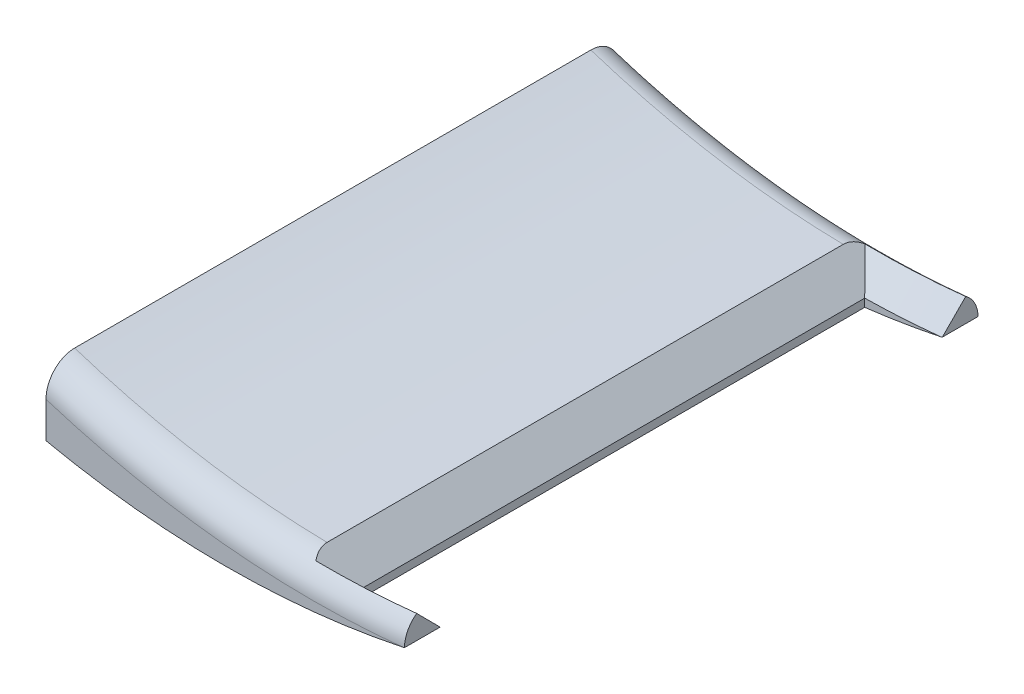
ISO-10303-21;
HEADER;
FILE_DESCRIPTION(('STEP AP214'),'2;1');
FILE_NAME('part.step','',(''),(''),'','','');
FILE_SCHEMA(('AUTOMOTIVE_DESIGN { 1 0 10303 214 1 1 1 1 }'));
ENDSEC;
DATA;
#1=APPLICATION_CONTEXT('core data for automotive mechanical design processes');
#2=APPLICATION_PROTOCOL_DEFINITION('international standard','automotive_design',2000,#1);
#3=PRODUCT_CONTEXT('',#1,'mechanical');
#4=PRODUCT('Part','Part','',(#3));
#5=PRODUCT_RELATED_PRODUCT_CATEGORY('part','',(#4));
#6=PRODUCT_DEFINITION_FORMATION('','',#4);
#7=PRODUCT_DEFINITION_CONTEXT('part definition',#1,'design');
#8=PRODUCT_DEFINITION('design','',#6,#7);
#9=PRODUCT_DEFINITION_SHAPE('','',#8);
#10=(LENGTH_UNIT() NAMED_UNIT(*) SI_UNIT(.MILLI.,.METRE.));
#11=(NAMED_UNIT(*) PLANE_ANGLE_UNIT() SI_UNIT($,.RADIAN.));
#12=(NAMED_UNIT(*) SI_UNIT($,.STERADIAN.) SOLID_ANGLE_UNIT());
#13=UNCERTAINTY_MEASURE_WITH_UNIT(LENGTH_MEASURE(1.E-05),#10,'distance_accuracy_value','');
#14=(GEOMETRIC_REPRESENTATION_CONTEXT(3) GLOBAL_UNCERTAINTY_ASSIGNED_CONTEXT((#13)) GLOBAL_UNIT_ASSIGNED_CONTEXT((#10,
#11,#12)) REPRESENTATION_CONTEXT('',''));
#15=CARTESIAN_POINT('',(0.,0.,0.));
#16=DIRECTION('',(0.,0.,1.));
#17=DIRECTION('',(1.,0.,0.));
#18=AXIS2_PLACEMENT_3D('',#15,#16,#17);
#19=CARTESIAN_POINT('',(31.75,0.,50.8));
#20=DIRECTION('',(-1.,0.,0.));
#21=DIRECTION('',(0.,0.,1.));
#22=AXIS2_PLACEMENT_3D('',#19,#20,#21);
#23=PLANE('',#22);
#24=DIRECTION('',(0.,0.,-1.));
#25=VECTOR('',#24,1.);
#26=CARTESIAN_POINT('',(31.75,0.,50.8));
#27=LINE('',#26,#25);
#28=CARTESIAN_POINT('',(31.75,0.,50.7999605180043));
#29=VERTEX_POINT('',#28);
#30=CARTESIAN_POINT('',(31.75,0.,47.6391621671897));
#31=VERTEX_POINT('',#30);
#32=EDGE_CURVE('E187',#29,#31,#27,.T.);
#33=ORIENTED_EDGE('',*,*,#32,.T.);
#34=CARTESIAN_POINT('',(31.75,0.,47.6391621671897));
#35=CARTESIAN_POINT('',(31.75,0.347081960183324,47.9843718611736));
#36=CARTESIAN_POINT('',(31.75,0.694176777536573,48.3295686263297));
#37=CARTESIAN_POINT('',(31.75,1.38839212659577,49.0199362989994));
#38=CARTESIAN_POINT('',(31.75,1.73551265830171,49.3651072065128));
#39=CARTESIAN_POINT('',(31.75,2.08264604717758,49.7102651851986));
#40=B_SPLINE_CURVE_WITH_KNOTS('',3,(#34,#35,#36,#37,#38,#39),.UNSPECIFIED.,.F.,.F.,(4,2,4),(0.,
1.46857773718991,2.93715547443414),.UNSPECIFIED.);
#41=CARTESIAN_POINT('',(31.75,2.08264604717758,49.7102651851986));
#42=VERTEX_POINT('',#41);
#43=EDGE_CURVE('E251',#31,#42,#40,.T.);
#44=ORIENTED_EDGE('',*,*,#43,.T.);
#45=CARTESIAN_POINT('',(31.75,2.53999999999999,48.26));
#46=CARTESIAN_POINT('',(31.75,2.54000711541741,48.3311454793808));
#47=CARTESIAN_POINT('',(31.75,2.53699353764413,48.4022875808764));
#48=CARTESIAN_POINT('',(31.75,2.52498000334214,48.544060410305));
#49=CARTESIAN_POINT('',(31.75,2.51598040488143,48.6146911685696));
#50=CARTESIAN_POINT('',(31.75,2.49206081084875,48.754880935039));
#51=CARTESIAN_POINT('',(31.75,2.47714625884038,48.8244408677554));
#52=CARTESIAN_POINT('',(31.75,2.44152151778274,48.9620396607442));
#53=CARTESIAN_POINT('',(31.75,2.4208113862735,49.0300785361109));
#54=CARTESIAN_POINT('',(31.75,2.35016491563888,49.2312502522719));
#55=CARTESIAN_POINT('',(31.75,2.29170125913253,49.3615036653736));
#56=CARTESIAN_POINT('',(31.75,2.15382828389797,49.6102895055019));
#57=CARTESIAN_POINT('',(31.75,2.07442172675841,49.7288234750553));
#58=CARTESIAN_POINT('',(31.75,1.89669695928711,49.9512721927552));
#59=CARTESIAN_POINT('',(31.75,1.79833053997607,50.0551484791838));
#60=CARTESIAN_POINT('',(31.75,1.58561751217071,50.245036602651));
#61=CARTESIAN_POINT('',(31.75,1.47126742791714,50.3310445439522));
#62=CARTESIAN_POINT('',(31.75,1.22917708960081,50.4832440275209));
#63=CARTESIAN_POINT('',(31.75,1.10136528975839,50.5493216487146));
#64=CARTESIAN_POINT('',(31.75,0.836524710442424,50.6591667011175));
#65=CARTESIAN_POINT('',(31.75,0.699501046347454,50.7029464004725));
#66=CARTESIAN_POINT('',(31.75,0.468042296266167,50.7560618598585));
#67=CARTESIAN_POINT('',(31.75,0.375080553727432,50.7720578336263));
#68=CARTESIAN_POINT('',(31.75,0.188101414642044,50.793744294961));
#69=CARTESIAN_POINT('',(31.75,0.094085770280669,50.7994498931122));
#70=CARTESIAN_POINT('',(31.75,0.,50.7999605180043));
#71=B_SPLINE_CURVE_WITH_KNOTS('',3,(#45,#46,#47,#48,#49,#50,#51,#52,#53,#54,#55,#56,#57,#58,#59,
#60,#61,#62,#63,#64,#65,#66,#67,#68,#69,#70),.UNSPECIFIED.,.F.,.F.,(4,2,2,2,2,2,2,2,2,2,2,2,4),
(0.,0.213366580793513,0.426720399707228,0.639878321906285,0.853034127892344,1.27914893034338,
1.705207572189,2.13236418977464,2.5596138404695,2.98926127092012,3.41867205659007,
3.70112531335205,3.98316347161579),.UNSPECIFIED.);
#72=EDGE_CURVE('E235',#42,#29,#71,.T.);
#73=ORIENTED_EDGE('',*,*,#72,.T.);
#74=EDGE_LOOP('',(#33,#44,#73));
#75=FACE_BOUND('',#74,.T.);
#76=ADVANCED_FACE('F41',(#75),#23,.F.);
#77=CARTESIAN_POINT('',(15.875,74.5280106738399,50.8));
#78=DIRECTION('',(0.,0.,-1.));
#79=DIRECTION('',(-1.,0.,0.));
#80=AXIS2_PLACEMENT_3D('',#77,#78,#79);
#81=CYLINDRICAL_SURFACE('',#80,76.2);
#82=CARTESIAN_POINT('',(15.875,74.5280106738399,47.625));
#83=DIRECTION('',(0.,0.,1.));
#84=DIRECTION('',(1.,0.,0.));
#85=AXIS2_PLACEMENT_3D('',#82,#83,#84);
#86=CIRCLE('',#85,76.2);
#87=CARTESIAN_POINT('',(24.892,-1.13660266026758,47.625));
#88=VERTEX_POINT('',#87);
#89=CARTESIAN_POINT('',(31.6189381152693,-0.0277966963614096,47.625));
#90=VERTEX_POINT('',#89);
#91=EDGE_CURVE('E161',#88,#90,#86,.T.);
#92=ORIENTED_EDGE('',*,*,#91,.T.);
#93=CARTESIAN_POINT('',(31.6189381152693,-0.0277966963614096,47.625));
#94=CARTESIAN_POINT('',(31.6407859105183,-0.0231831008023858,47.6273596354758));
#95=CARTESIAN_POINT('',(31.6626316318704,-0.0185599116594206,47.6297196338129));
#96=CARTESIAN_POINT('',(31.7063189267806,-0.00929434620561249,47.6344403562094));
#97=CARTESIAN_POINT('',(31.7281605003388,-0.0046519698947695,47.6368010802689));
#98=CARTESIAN_POINT('',(31.75,0.,47.6391621671897));
#99=B_SPLINE_CURVE_WITH_KNOTS('',3,(#93,#94,#95,#96,#97,#98),.UNSPECIFIED.,.F.,.F.,(4,2,4),(0.,
0.0673617926019737,0.134723585203877),.UNSPECIFIED.);
#100=EDGE_CURVE('E259',#90,#31,#99,.T.);
#101=ORIENTED_EDGE('',*,*,#100,.T.);
#102=ORIENTED_EDGE('',*,*,#32,.F.);
#103=CARTESIAN_POINT('',(31.75,0.,50.7999605180043));
#104=CARTESIAN_POINT('',(31.7281604271963,-0.0046519854074364,50.7999736808657));
#105=CARTESIAN_POINT('',(31.7063188170688,-0.00929436947420386,50.7999835524627));
#106=CARTESIAN_POINT('',(31.6626315221586,-0.0185599349280018,50.7999967131279));
#107=CARTESIAN_POINT('',(31.6407858373759,-0.0231831163150256,50.8000000021961));
#108=CARTESIAN_POINT('',(31.6189381152694,-0.0277966963613739,50.8));
#109=B_SPLINE_CURVE_WITH_KNOTS('',3,(#103,#104,#105,#106,#107,#108),.UNSPECIFIED.,.F.,.F.,(4,2,
4),(0.,0.0669885799380031,0.133977159899155),.UNSPECIFIED.);
#110=CARTESIAN_POINT('',(31.6189381152694,-0.0277966963613818,50.8));
#111=VERTEX_POINT('',#110);
#112=EDGE_CURVE('E354',#29,#111,#109,.T.);
#113=ORIENTED_EDGE('',*,*,#112,.T.);
#114=CARTESIAN_POINT('',(15.875,74.5280106738399,50.8));
#115=DIRECTION('',(0.,0.,1.));
#116=DIRECTION('',(1.,0.,0.));
#117=AXIS2_PLACEMENT_3D('',#114,#115,#116);
#118=CIRCLE('',#117,76.2);
#119=CARTESIAN_POINT('',(0.,0.,50.8));
#120=VERTEX_POINT('',#119);
#121=EDGE_CURVE('E171',#120,#111,#118,.T.);
#122=ORIENTED_EDGE('',*,*,#121,.F.);
#123=DIRECTION('',(0.,0.,-1.));
#124=VECTOR('',#123,1.);
#125=CARTESIAN_POINT('',(0.,0.,50.8));
#126=LINE('',#125,#124);
#127=CARTESIAN_POINT('',(0.,0.,0.));
#128=VERTEX_POINT('',#127);
#129=EDGE_CURVE('E177',#120,#128,#126,.T.);
#130=ORIENTED_EDGE('',*,*,#129,.T.);
#131=CARTESIAN_POINT('',(15.875,74.5280106738399,0.));
#132=DIRECTION('',(0.,0.,1.));
#133=DIRECTION('',(1.,0.,0.));
#134=AXIS2_PLACEMENT_3D('',#131,#132,#133);
#135=CIRCLE('',#134,76.2);
#136=CARTESIAN_POINT('',(31.6189381152694,-0.0277966963613818,0.));
#137=VERTEX_POINT('',#136);
#138=EDGE_CURVE('E170',#128,#137,#135,.T.);
#139=ORIENTED_EDGE('',*,*,#138,.T.);
#140=CARTESIAN_POINT('',(31.6189381152694,-0.0277966963613818,0.));
#141=CARTESIAN_POINT('',(31.6407858373759,-0.0231831163150311,-2.19615210893405E-09));
#142=CARTESIAN_POINT('',(31.6626315221586,-0.0185599349280049,3.28687208429315E-06));
#143=CARTESIAN_POINT('',(31.7063188170688,-0.00929436947420212,1.64475373318454E-05));
#144=CARTESIAN_POINT('',(31.7281604271963,-0.00465198540743225,2.6319134340721E-05));
#145=CARTESIAN_POINT('',(31.75,0.,3.94819957358329E-05));
#146=B_SPLINE_CURVE_WITH_KNOTS('',3,(#140,#141,#142,#143,#144,#145),.UNSPECIFIED.,.F.,.F.,(4,2,
4),(0.,0.0669885799611532,0.133977159899158),.UNSPECIFIED.);
#147=CARTESIAN_POINT('',(31.75,0.,3.94819957352799E-05));
#148=VERTEX_POINT('',#147);
#149=EDGE_CURVE('E355',#137,#148,#146,.T.);
#150=ORIENTED_EDGE('',*,*,#149,.T.);
#151=CARTESIAN_POINT('',(31.75,0.,3.16083783281031));
#152=VERTEX_POINT('',#151);
#153=EDGE_CURVE('E186',#152,#148,#27,.T.);
#154=ORIENTED_EDGE('',*,*,#153,.F.);
#155=CARTESIAN_POINT('',(31.75,0.,3.16083783281031));
#156=CARTESIAN_POINT('',(31.7281605003388,-0.00465196989477405,3.16319891973107));
#157=CARTESIAN_POINT('',(31.7063189267806,-0.00929434620561095,3.16555964379059));
#158=CARTESIAN_POINT('',(31.6626316318704,-0.0185599116594161,3.17028036618715));
#159=CARTESIAN_POINT('',(31.6407859105183,-0.0231831008023843,3.1726403645242));
#160=CARTESIAN_POINT('',(31.6189381152693,-0.0277966963614153,3.175));
#161=B_SPLINE_CURVE_WITH_KNOTS('',3,(#155,#156,#157,#158,#159,#160),.UNSPECIFIED.,.F.,.F.,(4,2,
4),(0.,0.0673617926018992,0.13472358520388),.UNSPECIFIED.);
#162=CARTESIAN_POINT('',(31.6189381152693,-0.0277966963614096,3.175));
#163=VERTEX_POINT('',#162);
#164=EDGE_CURVE('E149',#152,#163,#161,.T.);
#165=ORIENTED_EDGE('',*,*,#164,.T.);
#166=CARTESIAN_POINT('',(15.875,74.5280106738399,3.175));
#167=DIRECTION('',(0.,0.,-1.));
#168=DIRECTION('',(-1.,0.,0.));
#169=AXIS2_PLACEMENT_3D('',#166,#167,#168);
#170=CIRCLE('',#169,76.2);
#171=CARTESIAN_POINT('',(24.8919999999999,-1.13660266026756,3.175));
#172=VERTEX_POINT('',#171);
#173=EDGE_CURVE('E142',#163,#172,#170,.T.);
#174=ORIENTED_EDGE('',*,*,#173,.T.);
#175=DIRECTION('',(0.,0.,-1.));
#176=VECTOR('',#175,1.);
#177=CARTESIAN_POINT('',(24.892,-1.13660266026756,50.8));
#178=LINE('',#177,#176);
#179=EDGE_CURVE('E146',#172,#88,#178,.F.);
#180=ORIENTED_EDGE('',*,*,#179,.T.);
#181=EDGE_LOOP('',(#92,#101,#102,#113,#122,#130,#139,#150,#154,#165,#174,#180));
#182=FACE_BOUND('',#181,.T.);
#183=ADVANCED_FACE('F145',(#182),#81,.T.);
#184=CARTESIAN_POINT('',(31.75,0.,3.94819957357136E-05));
#185=CARTESIAN_POINT('',(31.75,0.0721261375730672,0.000432835467919209));
#186=CARTESIAN_POINT('',(31.75,0.144232165825652,0.00387855099690201));
#187=CARTESIAN_POINT('',(31.75,0.287896572910692,0.0168200309804969));
#188=CARTESIAN_POINT('',(31.75,0.359454972641264,0.0263155633904873));
#189=CARTESIAN_POINT('',(31.75,0.501479548830096,0.0512945211707885));
#190=CARTESIAN_POINT('',(31.75,0.571946356743182,0.0667743391667029));
#191=CARTESIAN_POINT('',(31.75,0.711308747662647,0.10359998270911));
#192=CARTESIAN_POINT('',(31.75,0.780204352501169,0.124945726693683));
#193=CARTESIAN_POINT('',(31.75,0.983875073282193,0.197617406979889));
#194=CARTESIAN_POINT('',(31.75,1.11568485982754,0.257586760273364));
#195=CARTESIAN_POINT('',(31.75,1.36723247753913,0.398811903449403));
#196=CARTESIAN_POINT('',(31.75,1.48697296729461,0.480062991201214));
#197=CARTESIAN_POINT('',(31.75,1.71078801821787,0.661396221291593));
#198=CARTESIAN_POINT('',(31.75,1.81489876006721,0.761433627574265));
#199=CARTESIAN_POINT('',(31.75,2.00475711672872,0.977673825231725));
#200=CARTESIAN_POINT('',(31.75,2.09050114704681,1.09387976481215));
#201=CARTESIAN_POINT('',(31.75,2.24069759450068,1.33849611661391));
#202=CARTESIAN_POINT('',(31.75,2.30525551930673,1.46684182022882));
#203=CARTESIAN_POINT('',(31.75,2.41174046982855,1.7325565980873));
#204=CARTESIAN_POINT('',(31.75,2.45368350607421,1.86991921119392));
#205=CARTESIAN_POINT('',(31.75,2.50242292228549,2.09687947920786));
#206=CARTESIAN_POINT('',(31.75,2.51650720301846,2.18497814569898));
#207=CARTESIAN_POINT('',(31.75,2.53529319962916,2.36203821612011));
#208=CARTESIAN_POINT('',(31.75,2.54000875681746,2.45099815191533));
#209=CARTESIAN_POINT('',(31.75,2.54,2.54));
#210=B_SPLINE_CURVE_WITH_KNOTS('',3,(#184,#185,#186,#187,#188,#189,#190,#191,#192,#193,#194,
#195,#196,#197,#198,#199,#200,#201,#202,#203,#204,#205,#206,#207,#208,#209),.UNSPECIFIED.,.F.,
.F.,(4,2,2,2,2,2,2,2,2,2,2,2,4),(0.,0.21631158476205,0.432614873253433,0.648787975229504,
0.864958071609975,1.2971455609344,1.72923764025655,2.16031353026311,2.59147347363844,
3.0204524345617,3.44912729366216,3.71632113037987,3.98311992169222),.UNSPECIFIED.);
#211=CARTESIAN_POINT('',(31.75,2.08264604719354,1.08973481482423));
#212=VERTEX_POINT('',#211);
#213=EDGE_CURVE('E244',#148,#212,#210,.T.);
#214=ORIENTED_EDGE('',*,*,#213,.T.);
#215=CARTESIAN_POINT('',(31.75,2.08264604719353,1.08973481482424));
#216=CARTESIAN_POINT('',(31.75,1.73551265830856,1.4348927934997));
#217=CARTESIAN_POINT('',(31.75,1.38839212659674,1.78006370100613));
#218=CARTESIAN_POINT('',(31.75,0.694176777532229,2.47043137366815));
#219=CARTESIAN_POINT('',(31.75,0.34708196017954,2.81562813882374));
#220=CARTESIAN_POINT('',(31.75,0.,3.1608378328103));
#221=B_SPLINE_CURVE_WITH_KNOTS('',3,(#215,#216,#217,#218,#219,#220),.UNSPECIFIED.,.F.,.F.,(4,2,
4),(0.,1.46857773724185,2.93715547442938),.UNSPECIFIED.);
#222=EDGE_CURVE('E384',#212,#152,#221,.T.);
#223=ORIENTED_EDGE('',*,*,#222,.T.);
#224=ORIENTED_EDGE('',*,*,#153,.T.);
#225=EDGE_LOOP('',(#214,#223,#224));
#226=FACE_BOUND('',#225,.T.);
#227=ADVANCED_FACE('F225',(#226),#23,.F.);
#228=CARTESIAN_POINT('',(23.5824412790761,78.3010122988088,50.8));
#229=DIRECTION('',(0.,0.,-1.));
#230=DIRECTION('',(-1.,0.,0.));
#231=AXIS2_PLACEMENT_3D('',#228,#229,#230);
#232=CYLINDRICAL_SURFACE('',#231,76.2);
#233=CARTESIAN_POINT('',(23.5824412790761,78.3010122988088,48.26));
#234=DIRECTION('',(0.,0.,1.));
#235=DIRECTION('',(1.,0.,0.));
#236=AXIS2_PLACEMENT_3D('',#233,#234,#235);
#237=CIRCLE('',#236,76.2);
#238=CARTESIAN_POINT('',(0.,5.842,48.26));
#239=VERTEX_POINT('',#238);
#240=CARTESIAN_POINT('',(22.3533404432556,2.1109256002403,48.26));
#241=VERTEX_POINT('',#240);
#242=EDGE_CURVE('E190',#239,#241,#237,.T.);
#243=ORIENTED_EDGE('',*,*,#242,.T.);
#244=DIRECTION('',(0.,0.,-1.));
#245=VECTOR('',#244,1.);
#246=CARTESIAN_POINT('',(22.3533404432556,2.1109256002403,50.8));
#247=LINE('',#246,#245);
#248=CARTESIAN_POINT('',(22.3533404432556,2.1109256002403,2.54));
#249=VERTEX_POINT('',#248);
#250=EDGE_CURVE('E387',#241,#249,#247,.T.);
#251=ORIENTED_EDGE('',*,*,#250,.T.);
#252=CARTESIAN_POINT('',(23.5824412790761,78.3010122988088,2.54));
#253=DIRECTION('',(0.,0.,1.));
#254=DIRECTION('',(1.,0.,0.));
#255=AXIS2_PLACEMENT_3D('',#252,#253,#254);
#256=CIRCLE('',#255,76.2);
#257=CARTESIAN_POINT('',(0.,5.842,2.54));
#258=VERTEX_POINT('',#257);
#259=EDGE_CURVE('E193',#249,#258,#256,.F.);
#260=ORIENTED_EDGE('',*,*,#259,.T.);
#261=DIRECTION('',(0.,0.,-1.));
#262=VECTOR('',#261,1.);
#263=CARTESIAN_POINT('',(0.,5.842,50.8));
#264=LINE('',#263,#262);
#265=EDGE_CURVE('E183',#239,#258,#264,.T.);
#266=ORIENTED_EDGE('',*,*,#265,.F.);
#267=EDGE_LOOP('',(#243,#251,#260,#266));
#268=FACE_BOUND('',#267,.T.);
#269=ADVANCED_FACE('F218',(#268),#232,.F.);
#270=CARTESIAN_POINT('',(0.,0.,50.8));
#271=DIRECTION('',(1.,0.,0.));
#272=DIRECTION('',(0.,0.,-1.));
#273=AXIS2_PLACEMENT_3D('',#270,#271,#272);
#274=PLANE('',#273);
#275=ORIENTED_EDGE('',*,*,#265,.T.);
#276=CARTESIAN_POINT('',(0.,5.842,2.54));
#277=CARTESIAN_POINT('',(0.,5.84200911651623,2.47106789074667));
#278=CARTESIAN_POINT('',(0.,5.83904918351451,2.40214016978724));
#279=CARTESIAN_POINT('',(0.,5.82726133043643,2.26479840193036));
#280=CARTESIAN_POINT('',(0.,5.81843429328041,2.19638427930961));
#281=CARTESIAN_POINT('',(0.,5.79500714800403,2.06069745438624));
#282=CARTESIAN_POINT('',(0.,5.78041931058092,1.99342264090847));
#283=CARTESIAN_POINT('',(0.,5.74562027031349,1.86036244755737));
#284=CARTESIAN_POINT('',(0.,5.72540902434634,1.79457707910996));
#285=CARTESIAN_POINT('',(0.,5.65658639242905,1.60014762655043));
#286=CARTESIAN_POINT('',(0.,5.5997641977452,1.47430477855078));
#287=CARTESIAN_POINT('',(0.,5.46625123855288,1.23372960348994));
#288=CARTESIAN_POINT('',(0.,5.38955609859676,1.11899973083634));
#289=CARTESIAN_POINT('',(0.,5.2169247709793,0.901060352722734));
#290=CARTESIAN_POINT('',(0.,5.12061530132623,0.798146480984856));
#291=CARTESIAN_POINT('',(0.,4.91276403216685,0.609070887829376));
#292=CARTESIAN_POINT('',(0.,4.8012182995791,0.522913505888832));
#293=CARTESIAN_POINT('',(0.,4.56056297707693,0.365564305636138));
#294=CARTESIAN_POINT('',(0.,4.43087868262775,0.295252048871446));
#295=CARTESIAN_POINT('',(0.,4.16189599508564,0.17637436381451));
#296=CARTESIAN_POINT('',(0.,4.02259718766523,0.127809873395902));
#297=CARTESIAN_POINT('',(0.,3.76536671526077,0.0605003350236466));
#298=CARTESIAN_POINT('',(0.,3.64844318090178,0.0378288081534124));
#299=CARTESIAN_POINT('',(0.,3.41282476936742,0.00757740642679859));
#300=CARTESIAN_POINT('',(0.,3.29413257963437,-2.33974903120056E-05));
#301=CARTESIAN_POINT('',(0.,3.17541038229219,0.));
#302=B_SPLINE_CURVE_WITH_KNOTS('',3,(#276,#277,#278,#279,#280,#281,#282,#283,#284,#285,#286,
#287,#288,#289,#290,#291,#292,#293,#294,#295,#296,#297,#298,#299,#300,#301),.UNSPECIFIED.,.F.,
.F.,(4,2,2,2,2,2,2,2,2,2,2,2,4),(0.,0.206725197324096,0.41341929232468,0.619675476349062,
0.825933242082334,1.23807164120409,1.65030085849603,2.07126525269274,2.49233852052409,
2.93294346250264,3.37356740376447,3.72992857358107,4.08579450883298),.UNSPECIFIED.);
#303=CARTESIAN_POINT('',(0.,3.17541038229219,0.));
#304=VERTEX_POINT('',#303);
#305=EDGE_CURVE('E203',#258,#304,#302,.T.);
#306=ORIENTED_EDGE('',*,*,#305,.T.);
#307=DIRECTION('',(0.,-1.,0.));
#308=VECTOR('',#307,1.);
#309=CARTESIAN_POINT('',(0.,0.,0.));
#310=LINE('',#309,#308);
#311=EDGE_CURVE('E175',#304,#128,#310,.T.);
#312=ORIENTED_EDGE('',*,*,#311,.T.);
#313=ORIENTED_EDGE('',*,*,#129,.F.);
#314=DIRECTION('',(0.,-1.,0.));
#315=VECTOR('',#314,1.);
#316=CARTESIAN_POINT('',(0.,0.,50.8));
#317=LINE('',#316,#315);
#318=CARTESIAN_POINT('',(0.,3.17541038229219,50.8));
#319=VERTEX_POINT('',#318);
#320=EDGE_CURVE('E174',#319,#120,#317,.T.);
#321=ORIENTED_EDGE('',*,*,#320,.F.);
#322=CARTESIAN_POINT('',(0.,3.17541038229219,50.8));
#323=CARTESIAN_POINT('',(0.,3.25318774515099,50.7999975289093));
#324=CARTESIAN_POINT('',(0.,3.33092820922483,50.7967461678686));
#325=CARTESIAN_POINT('',(0.,3.48586906909553,50.783767412644));
#326=CARTESIAN_POINT('',(0.,3.5630694465063,50.7740397990637));
#327=CARTESIAN_POINT('',(0.,3.79311062821256,50.735182702435));
#328=CARTESIAN_POINT('',(0.,3.94443504324128,50.6963789369505));
#329=CARTESIAN_POINT('',(0.,4.23844812376183,50.5937778279549));
#330=CARTESIAN_POINT('',(0.,4.38112897358825,50.5299582429514));
#331=CARTESIAN_POINT('',(0.,4.65338074719441,50.3787675723494));
#332=CARTESIAN_POINT('',(0.,4.78295879441103,50.2914093793974));
#333=CARTESIAN_POINT('',(0.,5.02206885595859,50.0974373589533));
#334=CARTESIAN_POINT('',(0.,5.13198182596775,49.9912937283955));
#335=CARTESIAN_POINT('',(0.,5.33139055312792,49.7612196947848));
#336=CARTESIAN_POINT('',(0.,5.42088540988703,49.6372885077338));
#337=CARTESIAN_POINT('',(0.,5.57235885418762,49.381402103687));
#338=CARTESIAN_POINT('',(0.,5.63542529885297,49.2500898717283));
#339=CARTESIAN_POINT('',(0.,5.73738530498152,48.9784739933305));
#340=CARTESIAN_POINT('',(0.,5.77631114222621,48.8381826301435));
#341=CARTESIAN_POINT('',(0.,5.8155793190003,48.6237984245374));
#342=CARTESIAN_POINT('',(0.,5.82548269907093,48.5513408658893));
#343=CARTESIAN_POINT('',(0.,5.83868908707226,48.4059349544306));
#344=CARTESIAN_POINT('',(0.,5.84200183357788,48.3329874858174));
#345=CARTESIAN_POINT('',(0.,5.842,48.26));
#346=B_SPLINE_CURVE_WITH_KNOTS('',3,(#322,#323,#324,#325,#326,#327,#328,#329,#330,#331,#332,
#333,#334,#335,#336,#337,#338,#339,#340,#341,#342,#343,#344,#345),.UNSPECIFIED.,.F.,.F.,(4,2,2,
2,2,2,2,2,2,2,2,4),(0.,0.233190575157756,0.466389050531859,0.932656952395885,1.39934035545406,
1.86576866286887,2.32184895116288,2.77794934766453,3.2127968350292,3.64706167458433,
3.8661943261112,4.08500293755266),.UNSPECIFIED.);
#347=EDGE_CURVE('E195',#319,#239,#346,.T.);
#348=ORIENTED_EDGE('',*,*,#347,.T.);
#349=EDGE_LOOP('',(#275,#306,#312,#313,#321,#348));
#350=FACE_BOUND('',#349,.T.);
#351=ADVANCED_FACE('F212',(#350),#274,.F.);
#352=CARTESIAN_POINT('',(15.875,74.5280106738399,50.8));
#353=DIRECTION('',(0.,0.,1.));
#354=DIRECTION('',(1.,0.,0.));
#355=AXIS2_PLACEMENT_3D('',#352,#353,#354);
#356=PLANE('',#355);
#357=ORIENTED_EDGE('',*,*,#121,.T.);
#358=CARTESIAN_POINT('',(23.5824412790761,78.3010122988088,50.8));
#359=DIRECTION('',(0.,0.,1.));
#360=DIRECTION('',(1.,0.,0.));
#361=AXIS2_PLACEMENT_3D('',#358,#359,#360);
#362=CIRCLE('',#361,78.74);
#363=EDGE_CURVE('E334',#111,#319,#362,.F.);
#364=ORIENTED_EDGE('',*,*,#363,.T.);
#365=ORIENTED_EDGE('',*,*,#320,.T.);
#366=EDGE_LOOP('',(#357,#364,#365));
#367=FACE_BOUND('',#366,.T.);
#368=ADVANCED_FACE('F217',(#367),#356,.T.);
#369=CARTESIAN_POINT('',(15.875,74.5280106738399,0.));
#370=DIRECTION('',(0.,0.,1.));
#371=DIRECTION('',(1.,0.,0.));
#372=AXIS2_PLACEMENT_3D('',#369,#370,#371);
#373=PLANE('',#372);
#374=ORIENTED_EDGE('',*,*,#311,.F.);
#375=CARTESIAN_POINT('',(23.5824412790761,78.3010122988088,0.));
#376=DIRECTION('',(0.,0.,1.));
#377=DIRECTION('',(1.,0.,0.));
#378=AXIS2_PLACEMENT_3D('',#375,#376,#377);
#379=CIRCLE('',#378,78.74);
#380=EDGE_CURVE('E360',#304,#137,#379,.T.);
#381=ORIENTED_EDGE('',*,*,#380,.T.);
#382=ORIENTED_EDGE('',*,*,#138,.F.);
#383=EDGE_LOOP('',(#374,#381,#382));
#384=FACE_BOUND('',#383,.T.);
#385=ADVANCED_FACE('F220',(#384),#373,.F.);
#386=CARTESIAN_POINT('',(23.5824412790761,78.3010122988088,2.54));
#387=DIRECTION('',(0.,0.,1.));
#388=DIRECTION('',(1.,0.,0.));
#389=AXIS2_PLACEMENT_3D('',#386,#387,#388);
#390=TOROIDAL_SURFACE('',#389,78.74,2.54);
#391=CARTESIAN_POINT('',(22.3533404432556,2.1109256002403,2.54));
#392=CARTESIAN_POINT('',(22.3533252873991,2.11094075609685,2.48340598973235));
#393=CARTESIAN_POINT('',(22.3552626220017,2.10900342149426,2.42682365261345));
#394=CARTESIAN_POINT('',(22.3629257657331,2.10134027776284,2.31421974122416));
#395=CARTESIAN_POINT('',(22.3686484490808,2.09561759441514,2.2581977429626));
#396=CARTESIAN_POINT('',(22.383700842484,2.08056520101197,2.14763653891991));
#397=CARTESIAN_POINT('',(22.3929989683363,2.07126707515964,2.09308870490175));
#398=CARTESIAN_POINT('',(22.4149973607353,2.04926868276064,1.98539259080993));
#399=CARTESIAN_POINT('',(22.4276980652468,2.03656797824917,1.93224449187187));
#400=CARTESIAN_POINT('',(22.4704554378744,1.99381060562153,1.77577900473614));
#401=CARTESIAN_POINT('',(22.5052321287727,1.95903391472319,1.6749862618463));
#402=CARTESIAN_POINT('',(22.5852463627788,1.87901968071709,1.48196660375577));
#403=CARTESIAN_POINT('',(22.6305052180115,1.83376082548446,1.38975768385483));
#404=CARTESIAN_POINT('',(22.700895493479,1.76337055001694,1.26510434887582));
#405=CARTESIAN_POINT('',(22.7226599504689,1.74160609302697,1.22874790597293));
#406=CARTESIAN_POINT('',(22.7674620483114,1.69680399518457,1.15789464201534));
#407=CARTESIAN_POINT('',(22.7904943455257,1.67377169797022,1.12339106994537));
#408=CARTESIAN_POINT('',(22.8141381481073,1.65012789538865,1.08973481480143));
#409=B_SPLINE_CURVE_WITH_KNOTS('',3,(#391,#392,#393,#394,#395,#396,#397,#398,#399,#400,#401,
#402,#403,#404,#405,#406,#407,#408),.UNSPECIFIED.,.F.,.F.,(4,2,2,2,2,2,2,2,4),(0.,
0.16969683616592,0.339253718492489,0.507345981821646,0.675459891643873,1.01031679104958,
1.34586058608681,1.48871367876495,1.63100497545855),.UNSPECIFIED.);
#410=CARTESIAN_POINT('',(22.8141381481073,1.65012789538865,1.08973481480143));
#411=VERTEX_POINT('',#410);
#412=EDGE_CURVE('E258',#249,#411,#409,.T.);
#413=ORIENTED_EDGE('',*,*,#412,.T.);
#414=CARTESIAN_POINT('',(23.5824412790761,78.3010122988088,1.08973481480094));
#415=DIRECTION('',(0.,0.,1.));
#416=DIRECTION('',(1.,0.,0.));
#417=AXIS2_PLACEMENT_3D('',#414,#415,#416);
#418=CIRCLE('',#417,76.654734814801);
#419=EDGE_CURVE('E382',#411,#212,#418,.T.);
#420=ORIENTED_EDGE('',*,*,#419,.T.);
#421=ORIENTED_EDGE('',*,*,#213,.F.);
#422=ORIENTED_EDGE('',*,*,#149,.F.);
#423=ORIENTED_EDGE('',*,*,#380,.F.);
#424=ORIENTED_EDGE('',*,*,#305,.F.);
#425=ORIENTED_EDGE('',*,*,#259,.F.);
#426=EDGE_LOOP('',(#413,#420,#421,#422,#423,#424,#425));
#427=FACE_BOUND('',#426,.T.);
#428=ADVANCED_FACE('F311',(#427),#390,.T.);
#429=CARTESIAN_POINT('',(23.5824412790761,78.3010122988088,48.26));
#430=DIRECTION('',(0.,0.,1.));
#431=DIRECTION('',(1.,0.,0.));
#432=AXIS2_PLACEMENT_3D('',#429,#430,#431);
#433=TOROIDAL_SURFACE('',#432,78.74,2.54);
#434=ORIENTED_EDGE('',*,*,#72,.F.);
#435=CARTESIAN_POINT('',(23.5824412790761,78.3010122988088,49.7102651851991));
#436=DIRECTION('',(0.,0.,-1.));
#437=DIRECTION('',(-1.,0.,0.));
#438=AXIS2_PLACEMENT_3D('',#435,#436,#437);
#439=CIRCLE('',#438,76.654734814801);
#440=CARTESIAN_POINT('',(22.8141381481076,1.65012789538833,49.7102651851982));
#441=VERTEX_POINT('',#440);
#442=EDGE_CURVE('E326',#42,#441,#439,.T.);
#443=ORIENTED_EDGE('',*,*,#442,.T.);
#444=CARTESIAN_POINT('',(22.8141381481076,1.65012789538833,49.7102651851982));
#445=CARTESIAN_POINT('',(22.7839124873671,1.68035355612879,49.6672301574184));
#446=CARTESIAN_POINT('',(22.7546850756671,1.7095809678288,49.6228223161746));
#447=CARTESIAN_POINT('',(22.6984570278228,1.76580901567308,49.5311512484985));
#448=CARTESIAN_POINT('',(22.6714600360418,1.79280600745411,49.4838835592998));
#449=CARTESIAN_POINT('',(22.5938043860191,1.87046165747681,49.3368962478907));
#450=CARTESIAN_POINT('',(22.547078816031,1.91718722746487,49.2328254083182));
#451=CARTESIAN_POINT('',(22.4869624436177,1.97730359987826,49.068997756986));
#452=CARTESIAN_POINT('',(22.4685297324447,1.99573631105125,49.0128502317382));
#453=CARTESIAN_POINT('',(22.4354426795277,2.02882336396823,48.898374781331));
#454=CARTESIAN_POINT('',(22.420786402922,2.04347964057394,48.8400479903319));
#455=CARTESIAN_POINT('',(22.3956612142421,2.0686048292538,48.7219893380598));
#456=CARTESIAN_POINT('',(22.3851683060906,2.07909773740536,48.6622676933522));
#457=CARTESIAN_POINT('',(22.3685190321132,2.09574701138272,48.5416599233864));
#458=CARTESIAN_POINT('',(22.3623588829267,2.10190716056924,48.480774861868));
#459=CARTESIAN_POINT('',(22.3567455535829,2.10752048991302,48.3930957891806));
#460=CARTESIAN_POINT('',(22.3554697010703,2.10879634242562,48.3665152297682));
#461=CARTESIAN_POINT('',(22.3537669403424,2.11049910315357,48.3132913935877));
#462=CARTESIAN_POINT('',(22.3533403004384,2.11092574305756,48.2866480996597));
#463=CARTESIAN_POINT('',(22.3533404432556,2.11092560024031,48.26));
#464=B_SPLINE_CURVE_WITH_KNOTS('',3,(#444,#445,#446,#447,#448,#449,#450,#451,#452,#453,#454,
#455,#456,#457,#458,#459,#460,#461,#462,#463),.UNSPECIFIED.,.F.,.F.,(4,2,2,2,2,2,2,2,2,4),(0.,
0.181883088503869,0.364057715142796,0.731936252723369,0.917434773749267,1.10283806450553,
1.28715667355871,1.47131413530426,1.55121684565225,1.63114479750564),.UNSPECIFIED.);
#465=EDGE_CURVE('E331',#441,#241,#464,.T.);
#466=ORIENTED_EDGE('',*,*,#465,.T.);
#467=ORIENTED_EDGE('',*,*,#242,.F.);
#468=ORIENTED_EDGE('',*,*,#347,.F.);
#469=ORIENTED_EDGE('',*,*,#363,.F.);
#470=ORIENTED_EDGE('',*,*,#112,.F.);
#471=EDGE_LOOP('',(#434,#443,#466,#467,#468,#469,#470));
#472=FACE_BOUND('',#471,.T.);
#473=ADVANCED_FACE('F210',(#472),#433,.T.);
#474=CARTESIAN_POINT('',(31.75,-34.29,47.625));
#475=DIRECTION('',(0.,0.,1.));
#476=DIRECTION('',(1.,0.,0.));
#477=AXIS2_PLACEMENT_3D('',#474,#475,#476);
#478=PLANE('',#477);
#479=DIRECTION('',(0.,1.,0.));
#480=VECTOR('',#479,1.);
#481=CARTESIAN_POINT('',(24.892,-34.29,47.625));
#482=LINE('',#481,#480);
#483=CARTESIAN_POINT('',(24.892,-0.428097031580907,47.625));
#484=VERTEX_POINT('',#483);
#485=EDGE_CURVE('E153',#88,#484,#482,.T.);
#486=ORIENTED_EDGE('',*,*,#485,.T.);
#487=CARTESIAN_POINT('',(23.5824412790761,78.3010122988088,47.625));
#488=DIRECTION('',(0.,0.,1.));
#489=DIRECTION('',(1.,0.,0.));
#490=AXIS2_PLACEMENT_3D('',#487,#488,#489);
#491=CIRCLE('',#490,78.74);
#492=EDGE_CURVE('E330',#484,#90,#491,.T.);
#493=ORIENTED_EDGE('',*,*,#492,.T.);
#494=ORIENTED_EDGE('',*,*,#91,.F.);
#495=EDGE_LOOP('',(#486,#493,#494));
#496=FACE_BOUND('',#495,.T.);
#497=ADVANCED_FACE('F303',(#496),#478,.F.);
#498=CARTESIAN_POINT('',(24.892,-34.29,3.175));
#499=DIRECTION('',(-1.,0.,0.));
#500=DIRECTION('',(0.,0.,1.));
#501=AXIS2_PLACEMENT_3D('',#498,#499,#500);
#502=PLANE('',#501);
#503=CARTESIAN_POINT('',(24.892,-0.428097031580893,3.175));
#504=CARTESIAN_POINT('',(24.892,-0.428036519068086,3.17493949585683));
#505=CARTESIAN_POINT('',(24.892,-0.42797600655528,3.17487899171365));
#506=CARTESIAN_POINT('',(24.892,-0.427854981529667,3.17475798342731));
#507=CARTESIAN_POINT('',(24.892,-0.427794469016861,3.17469747928414));
#508=CARTESIAN_POINT('',(24.892,-0.427733956504054,3.17463697514096));
#509=B_SPLINE_CURVE_WITH_KNOTS('',3,(#503,#504,#505,#506,#507,#508),.UNSPECIFIED.,.F.,.F.,(4,2,
4),(0.,0.000256715094851037,0.000513430189702075),.UNSPECIFIED.);
#510=CARTESIAN_POINT('',(24.892,-0.428097031580907,3.175));
#511=VERTEX_POINT('',#510);
#512=CARTESIAN_POINT('',(24.892,-0.427733956504056,3.17463697514096));
#513=VERTEX_POINT('',#512);
#514=EDGE_CURVE('E11',#511,#513,#509,.T.);
#515=ORIENTED_EDGE('',*,*,#514,.T.);
#516=DIRECTION('',(0.,0.,1.));
#517=VECTOR('',#516,1.);
#518=CARTESIAN_POINT('',(24.892,-0.427733956504056,3.175));
#519=LINE('',#518,#517);
#520=CARTESIAN_POINT('',(24.892,-0.427733956504056,47.625363024859));
#521=VERTEX_POINT('',#520);
#522=EDGE_CURVE('E65',#513,#521,#519,.T.);
#523=ORIENTED_EDGE('',*,*,#522,.T.);
#524=CARTESIAN_POINT('',(24.892,-0.427733956504056,47.625363024859));
#525=CARTESIAN_POINT('',(24.892,-0.427794469016862,47.6253025207159));
#526=CARTESIAN_POINT('',(24.892,-0.427854981529667,47.6252420165727));
#527=CARTESIAN_POINT('',(24.892,-0.427976006555276,47.6251210082863));
#528=CARTESIAN_POINT('',(24.892,-0.428036519068081,47.6250605041432));
#529=CARTESIAN_POINT('',(24.892,-0.428097031580886,47.625));
#530=B_SPLINE_CURVE_WITH_KNOTS('',3,(#524,#525,#526,#527,#528,#529),.UNSPECIFIED.,.F.,.F.,(4,2,
4),(0.,0.000256715094848354,0.000513430189701652),.UNSPECIFIED.);
#531=EDGE_CURVE('E57',#521,#484,#530,.T.);
#532=ORIENTED_EDGE('',*,*,#531,.T.);
#533=ORIENTED_EDGE('',*,*,#485,.F.);
#534=ORIENTED_EDGE('',*,*,#179,.F.);
#535=DIRECTION('',(0.,1.,0.));
#536=VECTOR('',#535,1.);
#537=CARTESIAN_POINT('',(24.892,-34.29,3.175));
#538=LINE('',#537,#536);
#539=EDGE_CURVE('E158',#172,#511,#538,.T.);
#540=ORIENTED_EDGE('',*,*,#539,.T.);
#541=EDGE_LOOP('',(#515,#523,#532,#533,#534,#540));
#542=FACE_BOUND('',#541,.T.);
#543=ADVANCED_FACE('F157',(#542),#502,.F.);
#544=CARTESIAN_POINT('',(31.75,-34.29,3.175));
#545=DIRECTION('',(0.,0.,-1.));
#546=DIRECTION('',(-1.,0.,0.));
#547=AXIS2_PLACEMENT_3D('',#544,#545,#546);
#548=PLANE('',#547);
#549=ORIENTED_EDGE('',*,*,#173,.F.);
#550=CARTESIAN_POINT('',(23.5824412790761,78.3010122988088,3.175));
#551=DIRECTION('',(0.,0.,-1.));
#552=DIRECTION('',(-1.,0.,0.));
#553=AXIS2_PLACEMENT_3D('',#550,#551,#552);
#554=CIRCLE('',#553,78.74);
#555=EDGE_CURVE('E164',#163,#511,#554,.T.);
#556=ORIENTED_EDGE('',*,*,#555,.T.);
#557=ORIENTED_EDGE('',*,*,#539,.F.);
#558=EDGE_LOOP('',(#549,#556,#557));
#559=FACE_BOUND('',#558,.T.);
#560=ADVANCED_FACE('F163',(#559),#548,.F.);
#561=CARTESIAN_POINT('',(23.5824412790761,78.3010122988088,0.634999999999955));
#562=DIRECTION('',(0.,0.,1.));
#563=DIRECTION('',(1.,0.,0.));
#564=AXIS2_PLACEMENT_3D('',#561,#562,#563);
#565=CONICAL_SURFACE('',#564,76.2,0.785398163397443);
#566=ORIENTED_EDGE('',*,*,#222,.F.);
#567=ORIENTED_EDGE('',*,*,#419,.F.);
#568=CARTESIAN_POINT('',(17.1793811341402,7.28488490935574,-4.26079585596177));
#569=CARTESIAN_POINT('',(17.8345693522984,6.62969669119751,-3.66704516736739));
#570=CARTESIAN_POINT('',(18.4863505455558,5.97791549794018,-3.06582496753418));
#571=CARTESIAN_POINT('',(19.7835747319627,4.68069131153325,-1.84994364292267));
#572=CARTESIAN_POINT('',(20.4290180123743,4.03524803112162,-1.23528313143105));
#573=CARTESIAN_POINT('',(21.713792357906,2.75047368558988,0.00573615733679637));
#574=CARTESIAN_POINT('',(22.3531262169092,2.11113982658676,0.632089158291636));
#575=CARTESIAN_POINT('',(23.6264601684782,0.83780587501771,1.89556141998333));
#576=CARTESIAN_POINT('',(24.2604601973824,0.203805846113556,2.5326808089498));
#577=CARTESIAN_POINT('',(25.5234237201565,-1.05915767666064,3.81647514425364));
#578=CARTESIAN_POINT('',(26.1523881183651,-1.68812207486917,4.46314831267169));
#579=CARTESIAN_POINT('',(27.4057821057927,-2.94151606229685,5.76522052948877));
#580=CARTESIAN_POINT('',(28.0302116938078,-3.56594565031189,6.42061958020464));
#581=CARTESIAN_POINT('',(29.2751945069537,-4.81092846345781,7.73963191534465));
#582=CARTESIAN_POINT('',(29.8957456732633,-5.43147962976745,8.40324908336394));
#583=CARTESIAN_POINT('',(31.1329654521258,-6.66869940862997,9.73765584170205));
#584=CARTESIAN_POINT('',(31.7496341266409,-7.28536808314504,10.4084453170919));
#585=CARTESIAN_POINT('',(32.3645235697321,-7.90025752623624,11.0824690271452));
#586=B_SPLINE_CURVE_WITH_KNOTS('',3,(#568,#569,#570,#571,#572,#573,#574,#575,#576,#577,#578,
#579,#580,#581,#582,#583,#584,#585),.UNSPECIFIED.,.F.,.F.,(4,2,2,2,2,2,2,2,4),(0.,
3.30140175263503,6.60265317408914,9.90231474694231,13.2020156470975,16.5011100337764,
19.8002052964249,23.100924080353,26.401590052609),.UNSPECIFIED.);
#587=EDGE_CURVE('E47',#513,#411,#586,.F.);
#588=ORIENTED_EDGE('',*,*,#587,.F.);
#589=ORIENTED_EDGE('',*,*,#514,.F.);
#590=ORIENTED_EDGE('',*,*,#555,.F.);
#591=ORIENTED_EDGE('',*,*,#164,.F.);
#592=EDGE_LOOP('',(#566,#567,#588,#589,#590,#591));
#593=FACE_BOUND('',#592,.T.);
#594=ADVANCED_FACE('F44',(#593),#565,.F.);
#595=CARTESIAN_POINT('',(22.3533404432556,2.11092560024032,50.8));
#596=DIRECTION('',(-0.70710678118655,-0.707106781186545,0.));
#597=DIRECTION('',(0.,0.,-1.));
#598=AXIS2_PLACEMENT_3D('',#595,#596,#597);
#599=PLANE('',#598);
#600=ORIENTED_EDGE('',*,*,#250,.F.);
#601=ORIENTED_EDGE('',*,*,#465,.F.);
#602=CARTESIAN_POINT('',(32.4412558165528,-7.97698977305691,39.6333896349071));
#603=CARTESIAN_POINT('',(31.8201166039811,-7.35585056048523,40.3147020682149));
#604=CARTESIAN_POINT('',(31.1971670104965,-6.73290096700067,40.9927259816346));
#605=CARTESIAN_POINT('',(29.9473136897264,-5.48304764623054,42.3414734706789));
#606=CARTESIAN_POINT('',(29.3204098978149,-4.85614385431903,43.0121969264966));
#607=CARTESIAN_POINT('',(28.0626512685813,-3.59838522508545,44.3452627728831));
#608=CARTESIAN_POINT('',(27.4317985752047,-2.96753253170879,45.0076092059925));
#609=CARTESIAN_POINT('',(26.165467488214,-1.70120144471814,46.3234034099291));
#610=CARTESIAN_POINT('',(25.5299890956013,-1.0657230521054,46.9768511826823));
#611=CARTESIAN_POINT('',(24.2538898386291,0.210376204866782,48.2739979296175));
#612=CARTESIAN_POINT('',(23.6132680213097,0.850998022186187,48.9176950303224));
#613=CARTESIAN_POINT('',(22.3265745193562,2.13769152413969,50.1940852539878));
#614=CARTESIAN_POINT('',(21.6805029022322,2.78376314126374,50.8267785129633));
#615=CARTESIAN_POINT('',(20.3821117039469,4.08215433954904,52.0802095292046));
#616=CARTESIAN_POINT('',(19.7297892039566,4.73447683953933,52.7009412484739));
#617=CARTESIAN_POINT('',(18.4186565451181,6.04560949837781,53.9286350331676));
#618=CARTESIAN_POINT('',(17.7598460815376,6.70441996195834,54.5355964473501));
#619=CARTESIAN_POINT('',(17.0975457235278,7.36672031996812,55.134896469921));
#620=B_SPLINE_CURVE_WITH_KNOTS('',3,(#602,#603,#604,#605,#606,#607,#608,#609,#610,#611,#612,
#613,#614,#615,#616,#617,#618,#619),.UNSPECIFIED.,.F.,.F.,(4,2,2,2,2,2,2,2,4),(0.,
3.33501928210352,6.67009321248313,10.0034910876941,13.336888241394,16.670917945547,
20.0049064094755,23.3405359213249,26.6763228583264),.UNSPECIFIED.);
#621=EDGE_CURVE('E167',#521,#441,#620,.T.);
#622=ORIENTED_EDGE('',*,*,#621,.F.);
#623=ORIENTED_EDGE('',*,*,#522,.F.);
#624=ORIENTED_EDGE('',*,*,#587,.T.);
#625=ORIENTED_EDGE('',*,*,#412,.F.);
#626=EDGE_LOOP('',(#600,#601,#622,#623,#624,#625));
#627=FACE_BOUND('',#626,.T.);
#628=ADVANCED_FACE('F277',(#627),#599,.F.);
#629=CARTESIAN_POINT('',(23.5824412790761,78.3010122988088,50.165));
#630=DIRECTION('',(0.,0.,-1.));
#631=DIRECTION('',(-1.,0.,0.));
#632=AXIS2_PLACEMENT_3D('',#629,#630,#631);
#633=CONICAL_SURFACE('',#632,76.2,0.785398163397443);
#634=ORIENTED_EDGE('',*,*,#100,.F.);
#635=ORIENTED_EDGE('',*,*,#492,.F.);
#636=ORIENTED_EDGE('',*,*,#531,.F.);
#637=ORIENTED_EDGE('',*,*,#621,.T.);
#638=ORIENTED_EDGE('',*,*,#442,.F.);
#639=ORIENTED_EDGE('',*,*,#43,.F.);
#640=EDGE_LOOP('',(#634,#635,#636,#637,#638,#639));
#641=FACE_BOUND('',#640,.T.);
#642=ADVANCED_FACE('F271',(#641),#633,.F.);
#643=CLOSED_SHELL('',(#76,#183,#227,#269,#351,#368,#385,#428,#473,#497,#543,#560,#594,#628,#642));
#644=MANIFOLD_SOLID_BREP('B2',#643);
#645=ADVANCED_BREP_SHAPE_REPRESENTATION('',(#18,#644),#14);
#646=SHAPE_DEFINITION_REPRESENTATION(#9,#645);
ENDSEC;
END-ISO-10303-21;
